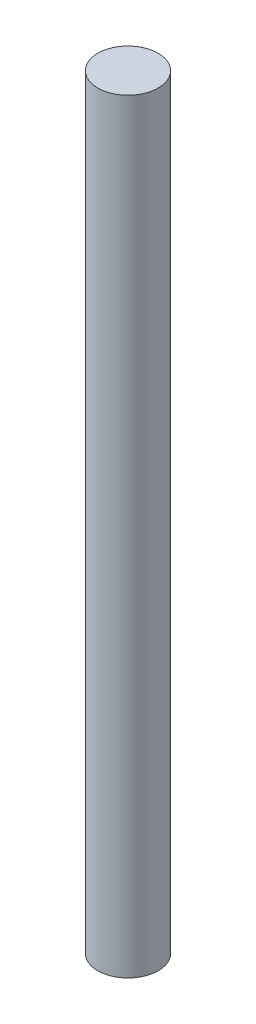
ISO-10303-21;
HEADER;
FILE_DESCRIPTION(('STEP AP214'),'2;1');
FILE_NAME('part.step','',(''),(''),'','','');
FILE_SCHEMA(('AUTOMOTIVE_DESIGN { 1 0 10303 214 1 1 1 1 }'));
ENDSEC;
DATA;
#1=APPLICATION_CONTEXT('core data for automotive mechanical design processes');
#2=APPLICATION_PROTOCOL_DEFINITION('international standard','automotive_design',2000,#1);
#3=PRODUCT_CONTEXT('',#1,'mechanical');
#4=PRODUCT('Part','Part','',(#3));
#5=PRODUCT_RELATED_PRODUCT_CATEGORY('part','',(#4));
#6=PRODUCT_DEFINITION_FORMATION('','',#4);
#7=PRODUCT_DEFINITION_CONTEXT('part definition',#1,'design');
#8=PRODUCT_DEFINITION('design','',#6,#7);
#9=PRODUCT_DEFINITION_SHAPE('','',#8);
#10=(LENGTH_UNIT() NAMED_UNIT(*) SI_UNIT(.MILLI.,.METRE.));
#11=(NAMED_UNIT(*) PLANE_ANGLE_UNIT() SI_UNIT($,.RADIAN.));
#12=(NAMED_UNIT(*) SI_UNIT($,.STERADIAN.) SOLID_ANGLE_UNIT());
#13=UNCERTAINTY_MEASURE_WITH_UNIT(LENGTH_MEASURE(1.E-05),#10,'distance_accuracy_value','');
#14=(GEOMETRIC_REPRESENTATION_CONTEXT(3) GLOBAL_UNCERTAINTY_ASSIGNED_CONTEXT((#13)) GLOBAL_UNIT_ASSIGNED_CONTEXT((#10,
#11,#12)) REPRESENTATION_CONTEXT('',''));
#15=CARTESIAN_POINT('',(0.,0.,0.));
#16=DIRECTION('',(0.,0.,1.));
#17=DIRECTION('',(1.,0.,0.));
#18=AXIS2_PLACEMENT_3D('',#15,#16,#17);
#19=CARTESIAN_POINT('',(0.,38.,0.));
#20=DIRECTION('',(0.,-1.,0.));
#21=DIRECTION('',(0.,0.,-1.));
#22=AXIS2_PLACEMENT_3D('',#19,#20,#21);
#23=CYLINDRICAL_SURFACE('',#22,1.5);
#24=CARTESIAN_POINT('',(0.,38.,0.));
#25=DIRECTION('',(0.,1.,0.));
#26=DIRECTION('',(0.,0.,1.));
#27=AXIS2_PLACEMENT_3D('',#24,#25,#26);
#28=CIRCLE('',#27,1.5);
#29=CARTESIAN_POINT('',(0.,38.,1.5));
#30=VERTEX_POINT('',#29);
#31=EDGE_CURVE('E10',#30,#30,#28,.T.);
#32=ORIENTED_EDGE('',*,*,#31,.F.);
#33=EDGE_LOOP('',(#32));
#34=FACE_BOUND('',#33,.T.);
#35=CARTESIAN_POINT('',(0.,0.,0.));
#36=DIRECTION('',(0.,1.,0.));
#37=DIRECTION('',(0.,0.,1.));
#38=AXIS2_PLACEMENT_3D('',#35,#36,#37);
#39=CIRCLE('',#38,1.5);
#40=CARTESIAN_POINT('',(0.,0.,1.5));
#41=VERTEX_POINT('',#40);
#42=EDGE_CURVE('E40',#41,#41,#39,.T.);
#43=ORIENTED_EDGE('',*,*,#42,.T.);
#44=EDGE_LOOP('',(#43));
#45=FACE_BOUND('',#44,.T.);
#46=ADVANCED_FACE('F37',(#34,#45),#23,.T.);
#47=CARTESIAN_POINT('',(0.,38.,0.));
#48=DIRECTION('',(0.,1.,0.));
#49=DIRECTION('',(0.,0.,1.));
#50=AXIS2_PLACEMENT_3D('',#47,#48,#49);
#51=PLANE('',#50);
#52=ORIENTED_EDGE('',*,*,#31,.T.);
#53=EDGE_LOOP('',(#52));
#54=FACE_BOUND('',#53,.T.);
#55=ADVANCED_FACE('F52',(#54),#51,.T.);
#56=CARTESIAN_POINT('',(0.,0.,0.));
#57=DIRECTION('',(0.,1.,0.));
#58=DIRECTION('',(0.,0.,1.));
#59=AXIS2_PLACEMENT_3D('',#56,#57,#58);
#60=PLANE('',#59);
#61=ORIENTED_EDGE('',*,*,#42,.F.);
#62=EDGE_LOOP('',(#61));
#63=FACE_BOUND('',#62,.T.);
#64=ADVANCED_FACE('F50',(#63),#60,.F.);
#65=CLOSED_SHELL('',(#46,#55,#64));
#66=MANIFOLD_SOLID_BREP('B2',#65);
#67=ADVANCED_BREP_SHAPE_REPRESENTATION('',(#18,#66),#14);
#68=SHAPE_DEFINITION_REPRESENTATION(#9,#67);
ENDSEC;
END-ISO-10303-21;
